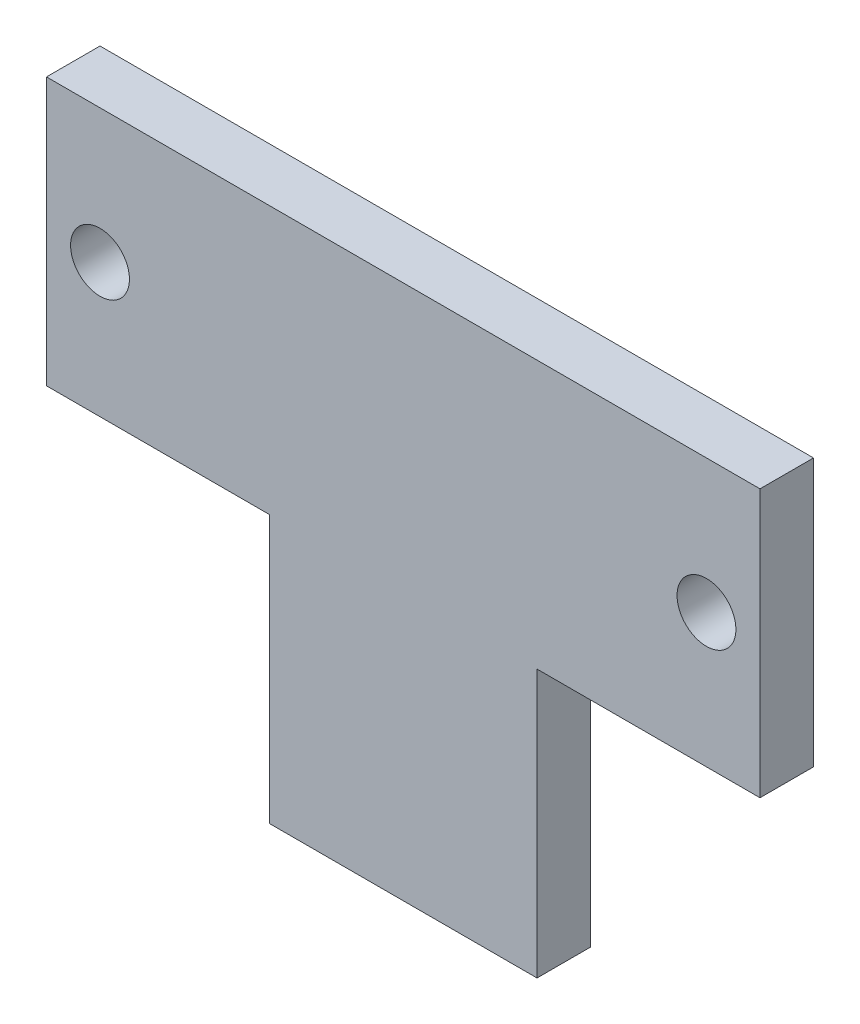
ISO-10303-21;
HEADER;
FILE_DESCRIPTION(('STEP AP214'),'2;1');
FILE_NAME('part.step','',(''),(''),'','','');
FILE_SCHEMA(('AUTOMOTIVE_DESIGN { 1 0 10303 214 1 1 1 1 }'));
ENDSEC;
DATA;
#1=APPLICATION_CONTEXT('core data for automotive mechanical design processes');
#2=APPLICATION_PROTOCOL_DEFINITION('international standard','automotive_design',2000,#1);
#3=PRODUCT_CONTEXT('',#1,'mechanical');
#4=PRODUCT('Part','Part','',(#3));
#5=PRODUCT_RELATED_PRODUCT_CATEGORY('part','',(#4));
#6=PRODUCT_DEFINITION_FORMATION('','',#4);
#7=PRODUCT_DEFINITION_CONTEXT('part definition',#1,'design');
#8=PRODUCT_DEFINITION('design','',#6,#7);
#9=PRODUCT_DEFINITION_SHAPE('','',#8);
#10=(LENGTH_UNIT() NAMED_UNIT(*) SI_UNIT(.MILLI.,.METRE.));
#11=(NAMED_UNIT(*) PLANE_ANGLE_UNIT() SI_UNIT($,.RADIAN.));
#12=(NAMED_UNIT(*) SI_UNIT($,.STERADIAN.) SOLID_ANGLE_UNIT());
#13=UNCERTAINTY_MEASURE_WITH_UNIT(LENGTH_MEASURE(1.E-05),#10,'distance_accuracy_value','');
#14=(GEOMETRIC_REPRESENTATION_CONTEXT(3) GLOBAL_UNCERTAINTY_ASSIGNED_CONTEXT((#13)) GLOBAL_UNIT_ASSIGNED_CONTEXT((#10,
#11,#12)) REPRESENTATION_CONTEXT('',''));
#15=CARTESIAN_POINT('',(0.,0.,0.));
#16=DIRECTION('',(0.,0.,1.));
#17=DIRECTION('',(1.,0.,0.));
#18=AXIS2_PLACEMENT_3D('',#15,#16,#17);
#19=CARTESIAN_POINT('',(20.,-7.5,-3.));
#20=DIRECTION('',(1.,0.,0.));
#21=DIRECTION('',(0.,0.,-1.));
#22=AXIS2_PLACEMENT_3D('',#19,#20,#21);
#23=PLANE('',#22);
#24=DIRECTION('',(0.,1.,0.));
#25=VECTOR('',#24,1.);
#26=CARTESIAN_POINT('',(20.,-7.5,0.));
#27=LINE('',#26,#25);
#28=CARTESIAN_POINT('',(20.,-7.5,0.));
#29=VERTEX_POINT('',#28);
#30=CARTESIAN_POINT('',(20.,7.5,0.));
#31=VERTEX_POINT('',#30);
#32=EDGE_CURVE('E130',#29,#31,#27,.T.);
#33=ORIENTED_EDGE('',*,*,#32,.F.);
#34=DIRECTION('',(0.,0.,1.));
#35=VECTOR('',#34,1.);
#36=CARTESIAN_POINT('',(20.,-7.5,-3.));
#37=LINE('',#36,#35);
#38=CARTESIAN_POINT('',(20.,-7.5,-3.));
#39=VERTEX_POINT('',#38);
#40=EDGE_CURVE('E11',#39,#29,#37,.T.);
#41=ORIENTED_EDGE('',*,*,#40,.F.);
#42=DIRECTION('',(0.,1.,0.));
#43=VECTOR('',#42,1.);
#44=CARTESIAN_POINT('',(20.,-7.5,-3.));
#45=LINE('',#44,#43);
#46=CARTESIAN_POINT('',(20.,7.5,-3.));
#47=VERTEX_POINT('',#46);
#48=EDGE_CURVE('E151',#39,#47,#45,.T.);
#49=ORIENTED_EDGE('',*,*,#48,.T.);
#50=DIRECTION('',(0.,0.,1.));
#51=VECTOR('',#50,1.);
#52=CARTESIAN_POINT('',(20.,7.5,-3.));
#53=LINE('',#52,#51);
#54=EDGE_CURVE('E36',#47,#31,#53,.T.);
#55=ORIENTED_EDGE('',*,*,#54,.T.);
#56=EDGE_LOOP('',(#33,#41,#49,#55));
#57=FACE_BOUND('',#56,.T.);
#58=ADVANCED_FACE('F33',(#57),#23,.T.);
#59=CARTESIAN_POINT('',(7.5,-7.5,-3.));
#60=DIRECTION('',(0.,-1.,0.));
#61=DIRECTION('',(1.,0.,0.));
#62=AXIS2_PLACEMENT_3D('',#59,#60,#61);
#63=PLANE('',#62);
#64=DIRECTION('',(1.,0.,0.));
#65=VECTOR('',#64,1.);
#66=CARTESIAN_POINT('',(7.5,-7.5,0.));
#67=LINE('',#66,#65);
#68=CARTESIAN_POINT('',(7.5,-7.5,0.));
#69=VERTEX_POINT('',#68);
#70=EDGE_CURVE('E149',#69,#29,#67,.T.);
#71=ORIENTED_EDGE('',*,*,#70,.F.);
#72=DIRECTION('',(0.,0.,1.));
#73=VECTOR('',#72,1.);
#74=CARTESIAN_POINT('',(7.5,-7.5,-3.));
#75=LINE('',#74,#73);
#76=CARTESIAN_POINT('',(7.5,-7.5,-3.));
#77=VERTEX_POINT('',#76);
#78=EDGE_CURVE('E42',#77,#69,#75,.T.);
#79=ORIENTED_EDGE('',*,*,#78,.F.);
#80=DIRECTION('',(1.,0.,0.));
#81=VECTOR('',#80,1.);
#82=CARTESIAN_POINT('',(7.5,-7.5,-3.));
#83=LINE('',#82,#81);
#84=EDGE_CURVE('E120',#77,#39,#83,.T.);
#85=ORIENTED_EDGE('',*,*,#84,.T.);
#86=ORIENTED_EDGE('',*,*,#40,.T.);
#87=EDGE_LOOP('',(#71,#79,#85,#86));
#88=FACE_BOUND('',#87,.T.);
#89=ADVANCED_FACE('F163',(#88),#63,.T.);
#90=CARTESIAN_POINT('',(7.5,-22.5,-3.));
#91=DIRECTION('',(1.,0.,0.));
#92=DIRECTION('',(0.,0.,-1.));
#93=AXIS2_PLACEMENT_3D('',#90,#91,#92);
#94=PLANE('',#93);
#95=DIRECTION('',(0.,1.,0.));
#96=VECTOR('',#95,1.);
#97=CARTESIAN_POINT('',(7.5,-22.5,0.));
#98=LINE('',#97,#96);
#99=CARTESIAN_POINT('',(7.5,-22.5,0.));
#100=VERTEX_POINT('',#99);
#101=EDGE_CURVE('E107',#100,#69,#98,.T.);
#102=ORIENTED_EDGE('',*,*,#101,.F.);
#103=DIRECTION('',(0.,0.,1.));
#104=VECTOR('',#103,1.);
#105=CARTESIAN_POINT('',(7.5,-22.5,-3.));
#106=LINE('',#105,#104);
#107=CARTESIAN_POINT('',(7.5,-22.5,-3.));
#108=VERTEX_POINT('',#107);
#109=EDGE_CURVE('E102',#108,#100,#106,.T.);
#110=ORIENTED_EDGE('',*,*,#109,.F.);
#111=DIRECTION('',(0.,1.,0.));
#112=VECTOR('',#111,1.);
#113=CARTESIAN_POINT('',(7.5,-22.5,-3.));
#114=LINE('',#113,#112);
#115=EDGE_CURVE('E105',#108,#77,#114,.T.);
#116=ORIENTED_EDGE('',*,*,#115,.T.);
#117=ORIENTED_EDGE('',*,*,#78,.T.);
#118=EDGE_LOOP('',(#102,#110,#116,#117));
#119=FACE_BOUND('',#118,.T.);
#120=ADVANCED_FACE('F104',(#119),#94,.T.);
#121=CARTESIAN_POINT('',(-7.5,-22.5,-3.));
#122=DIRECTION('',(0.,-1.,0.));
#123=DIRECTION('',(0.,0.,-1.));
#124=AXIS2_PLACEMENT_3D('',#121,#122,#123);
#125=PLANE('',#124);
#126=DIRECTION('',(1.,0.,0.));
#127=VECTOR('',#126,1.);
#128=CARTESIAN_POINT('',(-7.5,-22.5,0.));
#129=LINE('',#128,#127);
#130=CARTESIAN_POINT('',(-7.5,-22.5,0.));
#131=VERTEX_POINT('',#130);
#132=EDGE_CURVE('E146',#131,#100,#129,.T.);
#133=ORIENTED_EDGE('',*,*,#132,.F.);
#134=DIRECTION('',(0.,0.,1.));
#135=VECTOR('',#134,1.);
#136=CARTESIAN_POINT('',(-7.5,-22.5,-3.));
#137=LINE('',#136,#135);
#138=CARTESIAN_POINT('',(-7.5,-22.5,-3.));
#139=VERTEX_POINT('',#138);
#140=EDGE_CURVE('E112',#139,#131,#137,.T.);
#141=ORIENTED_EDGE('',*,*,#140,.F.);
#142=DIRECTION('',(1.,0.,0.));
#143=VECTOR('',#142,1.);
#144=CARTESIAN_POINT('',(-7.5,-22.5,-3.));
#145=LINE('',#144,#143);
#146=EDGE_CURVE('E118',#139,#108,#145,.T.);
#147=ORIENTED_EDGE('',*,*,#146,.T.);
#148=ORIENTED_EDGE('',*,*,#109,.T.);
#149=EDGE_LOOP('',(#133,#141,#147,#148));
#150=FACE_BOUND('',#149,.T.);
#151=ADVANCED_FACE('F122',(#150),#125,.T.);
#152=CARTESIAN_POINT('',(-7.5,-7.5,-3.));
#153=DIRECTION('',(-1.,0.,0.));
#154=DIRECTION('',(0.,0.,1.));
#155=AXIS2_PLACEMENT_3D('',#152,#153,#154);
#156=PLANE('',#155);
#157=DIRECTION('',(0.,-1.,0.));
#158=VECTOR('',#157,1.);
#159=CARTESIAN_POINT('',(-7.5,-7.5,0.));
#160=LINE('',#159,#158);
#161=CARTESIAN_POINT('',(-7.5,-7.5,0.));
#162=VERTEX_POINT('',#161);
#163=EDGE_CURVE('E143',#162,#131,#160,.T.);
#164=ORIENTED_EDGE('',*,*,#163,.F.);
#165=DIRECTION('',(0.,0.,1.));
#166=VECTOR('',#165,1.);
#167=CARTESIAN_POINT('',(-7.5,-7.5,-3.));
#168=LINE('',#167,#166);
#169=CARTESIAN_POINT('',(-7.5,-7.5,-3.));
#170=VERTEX_POINT('',#169);
#171=EDGE_CURVE('E155',#170,#162,#168,.T.);
#172=ORIENTED_EDGE('',*,*,#171,.F.);
#173=DIRECTION('',(0.,-1.,0.));
#174=VECTOR('',#173,1.);
#175=CARTESIAN_POINT('',(-7.5,-7.5,-3.));
#176=LINE('',#175,#174);
#177=EDGE_CURVE('E123',#170,#139,#176,.T.);
#178=ORIENTED_EDGE('',*,*,#177,.T.);
#179=ORIENTED_EDGE('',*,*,#140,.T.);
#180=EDGE_LOOP('',(#164,#172,#178,#179));
#181=FACE_BOUND('',#180,.T.);
#182=ADVANCED_FACE('F176',(#181),#156,.T.);
#183=CARTESIAN_POINT('',(-20.,-7.5,-3.));
#184=DIRECTION('',(0.,-1.,0.));
#185=DIRECTION('',(1.,0.,0.));
#186=AXIS2_PLACEMENT_3D('',#183,#184,#185);
#187=PLANE('',#186);
#188=DIRECTION('',(1.,0.,0.));
#189=VECTOR('',#188,1.);
#190=CARTESIAN_POINT('',(-20.,-7.5,0.));
#191=LINE('',#190,#189);
#192=CARTESIAN_POINT('',(-20.,-7.5,0.));
#193=VERTEX_POINT('',#192);
#194=EDGE_CURVE('E140',#193,#162,#191,.T.);
#195=ORIENTED_EDGE('',*,*,#194,.F.);
#196=DIRECTION('',(0.,0.,1.));
#197=VECTOR('',#196,1.);
#198=CARTESIAN_POINT('',(-20.,-7.5,-3.));
#199=LINE('',#198,#197);
#200=CARTESIAN_POINT('',(-20.,-7.5,-3.));
#201=VERTEX_POINT('',#200);
#202=EDGE_CURVE('E157',#201,#193,#199,.T.);
#203=ORIENTED_EDGE('',*,*,#202,.F.);
#204=DIRECTION('',(1.,0.,0.));
#205=VECTOR('',#204,1.);
#206=CARTESIAN_POINT('',(-20.,-7.5,-3.));
#207=LINE('',#206,#205);
#208=EDGE_CURVE('E125',#201,#170,#207,.T.);
#209=ORIENTED_EDGE('',*,*,#208,.T.);
#210=ORIENTED_EDGE('',*,*,#171,.T.);
#211=EDGE_LOOP('',(#195,#203,#209,#210));
#212=FACE_BOUND('',#211,.T.);
#213=ADVANCED_FACE('F179',(#212),#187,.T.);
#214=CARTESIAN_POINT('',(-20.,-7.5,-3.));
#215=DIRECTION('',(-1.,0.,0.));
#216=DIRECTION('',(0.,0.,1.));
#217=AXIS2_PLACEMENT_3D('',#214,#215,#216);
#218=PLANE('',#217);
#219=DIRECTION('',(0.,-1.,0.));
#220=VECTOR('',#219,1.);
#221=CARTESIAN_POINT('',(-20.,-7.5,0.));
#222=LINE('',#221,#220);
#223=CARTESIAN_POINT('',(-20.,7.5,0.));
#224=VERTEX_POINT('',#223);
#225=EDGE_CURVE('E137',#224,#193,#222,.T.);
#226=ORIENTED_EDGE('',*,*,#225,.F.);
#227=DIRECTION('',(0.,0.,1.));
#228=VECTOR('',#227,1.);
#229=CARTESIAN_POINT('',(-20.,7.5,-3.));
#230=LINE('',#229,#228);
#231=CARTESIAN_POINT('',(-20.,7.5,-3.));
#232=VERTEX_POINT('',#231);
#233=EDGE_CURVE('E158',#232,#224,#230,.T.);
#234=ORIENTED_EDGE('',*,*,#233,.F.);
#235=DIRECTION('',(0.,-1.,0.));
#236=VECTOR('',#235,1.);
#237=CARTESIAN_POINT('',(-20.,-7.5,-3.));
#238=LINE('',#237,#236);
#239=EDGE_CURVE('E225',#232,#201,#238,.T.);
#240=ORIENTED_EDGE('',*,*,#239,.T.);
#241=ORIENTED_EDGE('',*,*,#202,.T.);
#242=EDGE_LOOP('',(#226,#234,#240,#241));
#243=FACE_BOUND('',#242,.T.);
#244=ADVANCED_FACE('F183',(#243),#218,.T.);
#245=CARTESIAN_POINT('',(-20.,7.5,-3.));
#246=DIRECTION('',(0.,1.,0.));
#247=DIRECTION('',(0.,0.,1.));
#248=AXIS2_PLACEMENT_3D('',#245,#246,#247);
#249=PLANE('',#248);
#250=DIRECTION('',(-1.,0.,0.));
#251=VECTOR('',#250,1.);
#252=CARTESIAN_POINT('',(-20.,7.5,0.));
#253=LINE('',#252,#251);
#254=EDGE_CURVE('E133',#31,#224,#253,.T.);
#255=ORIENTED_EDGE('',*,*,#254,.F.);
#256=ORIENTED_EDGE('',*,*,#54,.F.);
#257=DIRECTION('',(-1.,0.,0.));
#258=VECTOR('',#257,1.);
#259=CARTESIAN_POINT('',(-20.,7.5,-3.));
#260=LINE('',#259,#258);
#261=EDGE_CURVE('E223',#47,#232,#260,.T.);
#262=ORIENTED_EDGE('',*,*,#261,.T.);
#263=ORIENTED_EDGE('',*,*,#233,.T.);
#264=EDGE_LOOP('',(#255,#256,#262,#263));
#265=FACE_BOUND('',#264,.T.);
#266=ADVANCED_FACE('F160',(#265),#249,.T.);
#267=CARTESIAN_POINT('',(0.,0.,-3.));
#268=DIRECTION('',(0.,0.,-1.));
#269=DIRECTION('',(-1.,0.,0.));
#270=AXIS2_PLACEMENT_3D('',#267,#268,#269);
#271=PLANE('',#270);
#272=CARTESIAN_POINT('',(17.,0.,-3.));
#273=DIRECTION('',(0.,0.,1.));
#274=DIRECTION('',(1.,0.,0.));
#275=AXIS2_PLACEMENT_3D('',#272,#273,#274);
#276=CIRCLE('',#275,1.65);
#277=CARTESIAN_POINT('',(18.65,0.,-3.));
#278=VERTEX_POINT('',#277);
#279=EDGE_CURVE('E210',#278,#278,#276,.T.);
#280=ORIENTED_EDGE('',*,*,#279,.T.);
#281=EDGE_LOOP('',(#280));
#282=FACE_BOUND('',#281,.T.);
#283=CARTESIAN_POINT('',(-17.,0.,-3.));
#284=DIRECTION('',(0.,0.,1.));
#285=DIRECTION('',(1.,0.,0.));
#286=AXIS2_PLACEMENT_3D('',#283,#284,#285);
#287=CIRCLE('',#286,1.65);
#288=CARTESIAN_POINT('',(-15.35,0.,-3.));
#289=VERTEX_POINT('',#288);
#290=EDGE_CURVE('E134',#289,#289,#287,.T.);
#291=ORIENTED_EDGE('',*,*,#290,.T.);
#292=EDGE_LOOP('',(#291));
#293=FACE_BOUND('',#292,.T.);
#294=ORIENTED_EDGE('',*,*,#48,.F.);
#295=ORIENTED_EDGE('',*,*,#84,.F.);
#296=ORIENTED_EDGE('',*,*,#115,.F.);
#297=ORIENTED_EDGE('',*,*,#146,.F.);
#298=ORIENTED_EDGE('',*,*,#177,.F.);
#299=ORIENTED_EDGE('',*,*,#208,.F.);
#300=ORIENTED_EDGE('',*,*,#239,.F.);
#301=ORIENTED_EDGE('',*,*,#261,.F.);
#302=EDGE_LOOP('',(#294,#295,#296,#297,#298,#299,#300,#301));
#303=FACE_BOUND('',#302,.T.);
#304=ADVANCED_FACE('F116',(#282,#293,#303),#271,.T.);
#305=CARTESIAN_POINT('',(0.,0.,0.));
#306=DIRECTION('',(0.,0.,-1.));
#307=DIRECTION('',(-1.,0.,0.));
#308=AXIS2_PLACEMENT_3D('',#305,#306,#307);
#309=PLANE('',#308);
#310=CARTESIAN_POINT('',(17.,0.,0.));
#311=DIRECTION('',(0.,0.,1.));
#312=DIRECTION('',(1.,0.,0.));
#313=AXIS2_PLACEMENT_3D('',#310,#311,#312);
#314=CIRCLE('',#313,1.65);
#315=CARTESIAN_POINT('',(18.65,0.,0.));
#316=VERTEX_POINT('',#315);
#317=EDGE_CURVE('E213',#316,#316,#314,.T.);
#318=ORIENTED_EDGE('',*,*,#317,.F.);
#319=EDGE_LOOP('',(#318));
#320=FACE_BOUND('',#319,.T.);
#321=CARTESIAN_POINT('',(-17.,0.,0.));
#322=DIRECTION('',(0.,0.,1.));
#323=DIRECTION('',(1.,0.,0.));
#324=AXIS2_PLACEMENT_3D('',#321,#322,#323);
#325=CIRCLE('',#324,1.65);
#326=CARTESIAN_POINT('',(-15.35,0.,0.));
#327=VERTEX_POINT('',#326);
#328=EDGE_CURVE('E215',#327,#327,#325,.T.);
#329=ORIENTED_EDGE('',*,*,#328,.F.);
#330=EDGE_LOOP('',(#329));
#331=FACE_BOUND('',#330,.T.);
#332=ORIENTED_EDGE('',*,*,#32,.T.);
#333=ORIENTED_EDGE('',*,*,#254,.T.);
#334=ORIENTED_EDGE('',*,*,#225,.T.);
#335=ORIENTED_EDGE('',*,*,#194,.T.);
#336=ORIENTED_EDGE('',*,*,#163,.T.);
#337=ORIENTED_EDGE('',*,*,#132,.T.);
#338=ORIENTED_EDGE('',*,*,#101,.T.);
#339=ORIENTED_EDGE('',*,*,#70,.T.);
#340=EDGE_LOOP('',(#332,#333,#334,#335,#336,#337,#338,#339));
#341=FACE_BOUND('',#340,.T.);
#342=ADVANCED_FACE('F162',(#320,#331,#341),#309,.F.);
#343=CARTESIAN_POINT('',(-17.,0.,-3.));
#344=DIRECTION('',(0.,0.,1.));
#345=DIRECTION('',(1.,0.,0.));
#346=AXIS2_PLACEMENT_3D('',#343,#344,#345);
#347=CYLINDRICAL_SURFACE('',#346,1.65);
#348=ORIENTED_EDGE('',*,*,#290,.F.);
#349=EDGE_LOOP('',(#348));
#350=FACE_BOUND('',#349,.T.);
#351=ORIENTED_EDGE('',*,*,#328,.T.);
#352=EDGE_LOOP('',(#351));
#353=FACE_BOUND('',#352,.T.);
#354=ADVANCED_FACE('F195',(#350,#353),#347,.F.);
#355=CARTESIAN_POINT('',(17.,0.,-3.));
#356=DIRECTION('',(0.,0.,1.));
#357=DIRECTION('',(1.,0.,0.));
#358=AXIS2_PLACEMENT_3D('',#355,#356,#357);
#359=CYLINDRICAL_SURFACE('',#358,1.65);
#360=ORIENTED_EDGE('',*,*,#279,.F.);
#361=EDGE_LOOP('',(#360));
#362=FACE_BOUND('',#361,.T.);
#363=ORIENTED_EDGE('',*,*,#317,.T.);
#364=EDGE_LOOP('',(#363));
#365=FACE_BOUND('',#364,.T.);
#366=ADVANCED_FACE('F202',(#362,#365),#359,.F.);
#367=CLOSED_SHELL('',(#58,#89,#120,#151,#182,#213,#244,#266,#304,#342,#354,#366));
#368=MANIFOLD_SOLID_BREP('B2',#367);
#369=ADVANCED_BREP_SHAPE_REPRESENTATION('',(#18,#368),#14);
#370=SHAPE_DEFINITION_REPRESENTATION(#9,#369);
ENDSEC;
END-ISO-10303-21;
